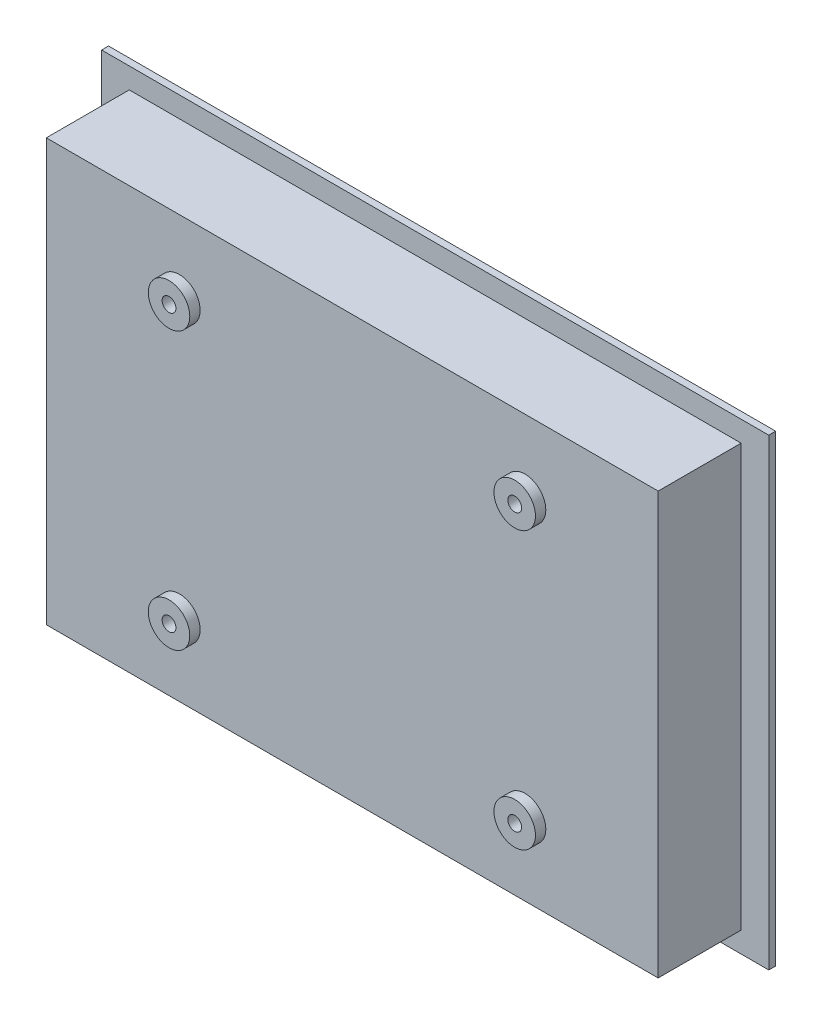
ISO-10303-21;
HEADER;
FILE_DESCRIPTION(('STEP AP214'),'2;1');
FILE_NAME('part.step','',(''),(''),'','','');
FILE_SCHEMA(('AUTOMOTIVE_DESIGN { 1 0 10303 214 1 1 1 1 }'));
ENDSEC;
DATA;
#1=APPLICATION_CONTEXT('core data for automotive mechanical design processes');
#2=APPLICATION_PROTOCOL_DEFINITION('international standard','automotive_design',2000,#1);
#3=PRODUCT_CONTEXT('',#1,'mechanical');
#4=PRODUCT('Part','Part','',(#3));
#5=PRODUCT_RELATED_PRODUCT_CATEGORY('part','',(#4));
#6=PRODUCT_DEFINITION_FORMATION('','',#4);
#7=PRODUCT_DEFINITION_CONTEXT('part definition',#1,'design');
#8=PRODUCT_DEFINITION('design','',#6,#7);
#9=PRODUCT_DEFINITION_SHAPE('','',#8);
#10=(LENGTH_UNIT() NAMED_UNIT(*) SI_UNIT(.MILLI.,.METRE.));
#11=(NAMED_UNIT(*) PLANE_ANGLE_UNIT() SI_UNIT($,.RADIAN.));
#12=(NAMED_UNIT(*) SI_UNIT($,.STERADIAN.) SOLID_ANGLE_UNIT());
#13=UNCERTAINTY_MEASURE_WITH_UNIT(LENGTH_MEASURE(1.E-05),#10,'distance_accuracy_value','');
#14=(GEOMETRIC_REPRESENTATION_CONTEXT(3) GLOBAL_UNCERTAINTY_ASSIGNED_CONTEXT((#13)) GLOBAL_UNIT_ASSIGNED_CONTEXT((#10,
#11,#12)) REPRESENTATION_CONTEXT('',''));
#15=CARTESIAN_POINT('',(0.,0.,0.));
#16=DIRECTION('',(0.,0.,1.));
#17=DIRECTION('',(1.,0.,0.));
#18=AXIS2_PLACEMENT_3D('',#15,#16,#17);
#19=CARTESIAN_POINT('',(0.,0.,26.));
#20=DIRECTION('',(0.,0.,1.));
#21=DIRECTION('',(1.,0.,0.));
#22=AXIS2_PLACEMENT_3D('',#19,#20,#21);
#23=PLANE('',#22);
#24=CARTESIAN_POINT('',(50.,-40.,26.));
#25=DIRECTION('',(0.,0.,1.));
#26=DIRECTION('',(1.,0.,0.));
#27=AXIS2_PLACEMENT_3D('',#24,#25,#26);
#28=CIRCLE('',#27,5.99999999999999);
#29=CARTESIAN_POINT('',(56.,-40.,26.));
#30=VERTEX_POINT('',#29);
#31=EDGE_CURVE('E454',#30,#30,#28,.T.);
#32=ORIENTED_EDGE('',*,*,#31,.F.);
#33=EDGE_LOOP('',(#32));
#34=FACE_BOUND('',#33,.T.);
#35=CARTESIAN_POINT('',(-50.,40.,26.));
#36=DIRECTION('',(0.,0.,1.));
#37=DIRECTION('',(1.,0.,0.));
#38=AXIS2_PLACEMENT_3D('',#35,#36,#37);
#39=CIRCLE('',#38,6.);
#40=CARTESIAN_POINT('',(-44.,40.,26.));
#41=VERTEX_POINT('',#40);
#42=EDGE_CURVE('E472',#41,#41,#39,.T.);
#43=ORIENTED_EDGE('',*,*,#42,.F.);
#44=EDGE_LOOP('',(#43));
#45=FACE_BOUND('',#44,.T.);
#46=DIRECTION('',(0.,1.,0.));
#47=VECTOR('',#46,1.);
#48=CARTESIAN_POINT('',(88.5,61.,26.));
#49=LINE('',#48,#47);
#50=CARTESIAN_POINT('',(88.5,-61.,26.));
#51=VERTEX_POINT('',#50);
#52=CARTESIAN_POINT('',(88.5,61.,26.));
#53=VERTEX_POINT('',#52);
#54=EDGE_CURVE('E121',#51,#53,#49,.T.);
#55=ORIENTED_EDGE('',*,*,#54,.T.);
#56=DIRECTION('',(-1.,0.,0.));
#57=VECTOR('',#56,1.);
#58=CARTESIAN_POINT('',(-88.5,61.,26.));
#59=LINE('',#58,#57);
#60=CARTESIAN_POINT('',(-88.5,61.,26.));
#61=VERTEX_POINT('',#60);
#62=EDGE_CURVE('E110',#53,#61,#59,.T.);
#63=ORIENTED_EDGE('',*,*,#62,.T.);
#64=DIRECTION('',(0.,-1.,0.));
#65=VECTOR('',#64,1.);
#66=CARTESIAN_POINT('',(-88.5,61.,26.));
#67=LINE('',#66,#65);
#68=CARTESIAN_POINT('',(-88.5,-61.,26.));
#69=VERTEX_POINT('',#68);
#70=EDGE_CURVE('E120',#61,#69,#67,.T.);
#71=ORIENTED_EDGE('',*,*,#70,.T.);
#72=DIRECTION('',(1.,0.,0.));
#73=VECTOR('',#72,1.);
#74=CARTESIAN_POINT('',(-88.5,-61.,26.));
#75=LINE('',#74,#73);
#76=EDGE_CURVE('E125',#69,#51,#75,.T.);
#77=ORIENTED_EDGE('',*,*,#76,.T.);
#78=EDGE_LOOP('',(#55,#63,#71,#77));
#79=FACE_BOUND('',#78,.T.);
#80=CARTESIAN_POINT('',(-50.,-40.,26.));
#81=DIRECTION('',(0.,0.,1.));
#82=DIRECTION('',(1.,0.,0.));
#83=AXIS2_PLACEMENT_3D('',#80,#81,#82);
#84=CIRCLE('',#83,6.);
#85=CARTESIAN_POINT('',(-44.,-40.,26.));
#86=VERTEX_POINT('',#85);
#87=EDGE_CURVE('E463',#86,#86,#84,.T.);
#88=ORIENTED_EDGE('',*,*,#87,.F.);
#89=EDGE_LOOP('',(#88));
#90=FACE_BOUND('',#89,.T.);
#91=CARTESIAN_POINT('',(50.,40.,26.));
#92=DIRECTION('',(0.,0.,1.));
#93=DIRECTION('',(1.,0.,0.));
#94=AXIS2_PLACEMENT_3D('',#91,#92,#93);
#95=CIRCLE('',#94,6.);
#96=CARTESIAN_POINT('',(56.,40.,26.));
#97=VERTEX_POINT('',#96);
#98=EDGE_CURVE('E443',#97,#97,#95,.T.);
#99=ORIENTED_EDGE('',*,*,#98,.F.);
#100=EDGE_LOOP('',(#99));
#101=FACE_BOUND('',#100,.T.);
#102=ADVANCED_FACE('F36',(#34,#45,#79,#90,#101),#23,.T.);
#103=CARTESIAN_POINT('',(0.,0.,2.));
#104=DIRECTION('',(0.,0.,1.));
#105=DIRECTION('',(1.,0.,0.));
#106=AXIS2_PLACEMENT_3D('',#103,#104,#105);
#107=PLANE('',#106);
#108=DIRECTION('',(0.,1.,0.));
#109=VECTOR('',#108,1.);
#110=CARTESIAN_POINT('',(96.5,67.,2.));
#111=LINE('',#110,#109);
#112=CARTESIAN_POINT('',(96.5000000000001,-67.,2.));
#113=VERTEX_POINT('',#112);
#114=CARTESIAN_POINT('',(96.5,67.,2.));
#115=VERTEX_POINT('',#114);
#116=EDGE_CURVE('E143',#113,#115,#111,.T.);
#117=ORIENTED_EDGE('',*,*,#116,.T.);
#118=DIRECTION('',(-1.,0.,0.));
#119=VECTOR('',#118,1.);
#120=CARTESIAN_POINT('',(-96.5,67.,2.));
#121=LINE('',#120,#119);
#122=CARTESIAN_POINT('',(-96.5,67.,2.));
#123=VERTEX_POINT('',#122);
#124=EDGE_CURVE('E88',#115,#123,#121,.T.);
#125=ORIENTED_EDGE('',*,*,#124,.T.);
#126=DIRECTION('',(0.,-1.,0.));
#127=VECTOR('',#126,1.);
#128=CARTESIAN_POINT('',(-96.5,67.,2.));
#129=LINE('',#128,#127);
#130=CARTESIAN_POINT('',(-96.5,-67.,2.));
#131=VERTEX_POINT('',#130);
#132=EDGE_CURVE('E146',#123,#131,#129,.T.);
#133=ORIENTED_EDGE('',*,*,#132,.T.);
#134=DIRECTION('',(1.,0.,0.));
#135=VECTOR('',#134,1.);
#136=CARTESIAN_POINT('',(-96.5,-67.,2.));
#137=LINE('',#136,#135);
#138=EDGE_CURVE('E60',#131,#113,#137,.T.);
#139=ORIENTED_EDGE('',*,*,#138,.T.);
#140=EDGE_LOOP('',(#117,#125,#133,#139));
#141=FACE_BOUND('',#140,.T.);
#142=DIRECTION('',(-1.,0.,0.));
#143=VECTOR('',#142,1.);
#144=CARTESIAN_POINT('',(-88.5,61.,2.));
#145=LINE('',#144,#143);
#146=CARTESIAN_POINT('',(88.5,61.,2.));
#147=VERTEX_POINT('',#146);
#148=CARTESIAN_POINT('',(-88.5,61.,2.));
#149=VERTEX_POINT('',#148);
#150=EDGE_CURVE('E492',#147,#149,#145,.T.);
#151=ORIENTED_EDGE('',*,*,#150,.F.);
#152=DIRECTION('',(0.,1.,0.));
#153=VECTOR('',#152,1.);
#154=CARTESIAN_POINT('',(88.5,61.,2.));
#155=LINE('',#154,#153);
#156=CARTESIAN_POINT('',(88.5,-61.,2.));
#157=VERTEX_POINT('',#156);
#158=EDGE_CURVE('E133',#157,#147,#155,.T.);
#159=ORIENTED_EDGE('',*,*,#158,.F.);
#160=DIRECTION('',(1.,0.,0.));
#161=VECTOR('',#160,1.);
#162=CARTESIAN_POINT('',(-88.5,-61.,2.));
#163=LINE('',#162,#161);
#164=CARTESIAN_POINT('',(-88.5,-61.,2.));
#165=VERTEX_POINT('',#164);
#166=EDGE_CURVE('E129',#165,#157,#163,.T.);
#167=ORIENTED_EDGE('',*,*,#166,.F.);
#168=DIRECTION('',(0.,-1.,0.));
#169=VECTOR('',#168,1.);
#170=CARTESIAN_POINT('',(-88.5,61.,2.));
#171=LINE('',#170,#169);
#172=EDGE_CURVE('E494',#149,#165,#171,.T.);
#173=ORIENTED_EDGE('',*,*,#172,.F.);
#174=EDGE_LOOP('',(#151,#159,#167,#173));
#175=FACE_BOUND('',#174,.T.);
#176=ADVANCED_FACE('F179',(#141,#175),#107,.T.);
#177=CARTESIAN_POINT('',(96.5,67.,2.));
#178=DIRECTION('',(-1.,0.,0.));
#179=DIRECTION('',(0.,-1.,0.));
#180=AXIS2_PLACEMENT_3D('',#177,#178,#179);
#181=PLANE('',#180);
#182=DIRECTION('',(0.,1.,0.));
#183=VECTOR('',#182,1.);
#184=CARTESIAN_POINT('',(96.5,67.,0.));
#185=LINE('',#184,#183);
#186=CARTESIAN_POINT('',(96.5000000000001,-67.,0.));
#187=VERTEX_POINT('',#186);
#188=CARTESIAN_POINT('',(96.5,67.,0.));
#189=VERTEX_POINT('',#188);
#190=EDGE_CURVE('E135',#187,#189,#185,.T.);
#191=ORIENTED_EDGE('',*,*,#190,.T.);
#192=DIRECTION('',(0.,0.,-1.));
#193=VECTOR('',#192,1.);
#194=CARTESIAN_POINT('',(96.5,67.,2.));
#195=LINE('',#194,#193);
#196=EDGE_CURVE('E11',#115,#189,#195,.T.);
#197=ORIENTED_EDGE('',*,*,#196,.F.);
#198=ORIENTED_EDGE('',*,*,#116,.F.);
#199=DIRECTION('',(0.,0.,-1.));
#200=VECTOR('',#199,1.);
#201=CARTESIAN_POINT('',(96.5000000000001,-67.,2.));
#202=LINE('',#201,#200);
#203=EDGE_CURVE('E148',#113,#187,#202,.T.);
#204=ORIENTED_EDGE('',*,*,#203,.T.);
#205=EDGE_LOOP('',(#191,#197,#198,#204));
#206=FACE_BOUND('',#205,.T.);
#207=ADVANCED_FACE('F38',(#206),#181,.F.);
#208=CARTESIAN_POINT('',(-96.5,67.,2.));
#209=DIRECTION('',(0.,-1.,0.));
#210=DIRECTION('',(0.,0.,-1.));
#211=AXIS2_PLACEMENT_3D('',#208,#209,#210);
#212=PLANE('',#211);
#213=DIRECTION('',(-1.,0.,0.));
#214=VECTOR('',#213,1.);
#215=CARTESIAN_POINT('',(-96.5,67.,0.));
#216=LINE('',#215,#214);
#217=CARTESIAN_POINT('',(-96.5,67.,0.));
#218=VERTEX_POINT('',#217);
#219=EDGE_CURVE('E138',#189,#218,#216,.T.);
#220=ORIENTED_EDGE('',*,*,#219,.T.);
#221=DIRECTION('',(0.,0.,-1.));
#222=VECTOR('',#221,1.);
#223=CARTESIAN_POINT('',(-96.5,67.,2.));
#224=LINE('',#223,#222);
#225=EDGE_CURVE('E44',#123,#218,#224,.T.);
#226=ORIENTED_EDGE('',*,*,#225,.F.);
#227=ORIENTED_EDGE('',*,*,#124,.F.);
#228=ORIENTED_EDGE('',*,*,#196,.T.);
#229=EDGE_LOOP('',(#220,#226,#227,#228));
#230=FACE_BOUND('',#229,.T.);
#231=ADVANCED_FACE('F176',(#230),#212,.F.);
#232=CARTESIAN_POINT('',(-96.5,67.,2.));
#233=DIRECTION('',(1.,0.,0.));
#234=DIRECTION('',(0.,0.,-1.));
#235=AXIS2_PLACEMENT_3D('',#232,#233,#234);
#236=PLANE('',#235);
#237=DIRECTION('',(0.,-1.,0.));
#238=VECTOR('',#237,1.);
#239=CARTESIAN_POINT('',(-96.5,67.,0.));
#240=LINE('',#239,#238);
#241=CARTESIAN_POINT('',(-96.5,-67.,0.));
#242=VERTEX_POINT('',#241);
#243=EDGE_CURVE('E151',#218,#242,#240,.T.);
#244=ORIENTED_EDGE('',*,*,#243,.T.);
#245=DIRECTION('',(0.,0.,-1.));
#246=VECTOR('',#245,1.);
#247=CARTESIAN_POINT('',(-96.5,-67.,2.));
#248=LINE('',#247,#246);
#249=EDGE_CURVE('E155',#131,#242,#248,.T.);
#250=ORIENTED_EDGE('',*,*,#249,.F.);
#251=ORIENTED_EDGE('',*,*,#132,.F.);
#252=ORIENTED_EDGE('',*,*,#225,.T.);
#253=EDGE_LOOP('',(#244,#250,#251,#252));
#254=FACE_BOUND('',#253,.T.);
#255=ADVANCED_FACE('F160',(#254),#236,.F.);
#256=CARTESIAN_POINT('',(-96.5,-67.,2.));
#257=DIRECTION('',(0.,1.,0.));
#258=DIRECTION('',(0.,0.,1.));
#259=AXIS2_PLACEMENT_3D('',#256,#257,#258);
#260=PLANE('',#259);
#261=DIRECTION('',(1.,0.,0.));
#262=VECTOR('',#261,1.);
#263=CARTESIAN_POINT('',(-96.5,-67.,0.));
#264=LINE('',#263,#262);
#265=EDGE_CURVE('E81',#242,#187,#264,.T.);
#266=ORIENTED_EDGE('',*,*,#265,.T.);
#267=ORIENTED_EDGE('',*,*,#203,.F.);
#268=ORIENTED_EDGE('',*,*,#138,.F.);
#269=ORIENTED_EDGE('',*,*,#249,.T.);
#270=EDGE_LOOP('',(#266,#267,#268,#269));
#271=FACE_BOUND('',#270,.T.);
#272=ADVANCED_FACE('F168',(#271),#260,.F.);
#273=CARTESIAN_POINT('',(0.,0.,0.));
#274=DIRECTION('',(0.,0.,1.));
#275=DIRECTION('',(1.,0.,0.));
#276=AXIS2_PLACEMENT_3D('',#273,#274,#275);
#277=PLANE('',#276);
#278=ORIENTED_EDGE('',*,*,#190,.F.);
#279=ORIENTED_EDGE('',*,*,#265,.F.);
#280=ORIENTED_EDGE('',*,*,#243,.F.);
#281=ORIENTED_EDGE('',*,*,#219,.F.);
#282=EDGE_LOOP('',(#278,#279,#280,#281));
#283=FACE_BOUND('',#282,.T.);
#284=ADVANCED_FACE('F164',(#283),#277,.F.);
#285=CARTESIAN_POINT('',(88.5,61.,26.));
#286=DIRECTION('',(-1.,0.,0.));
#287=DIRECTION('',(0.,0.,1.));
#288=AXIS2_PLACEMENT_3D('',#285,#286,#287);
#289=PLANE('',#288);
#290=ORIENTED_EDGE('',*,*,#158,.T.);
#291=DIRECTION('',(0.,0.,-1.));
#292=VECTOR('',#291,1.);
#293=CARTESIAN_POINT('',(88.5,61.,26.));
#294=LINE('',#293,#292);
#295=EDGE_CURVE('E114',#53,#147,#294,.T.);
#296=ORIENTED_EDGE('',*,*,#295,.F.);
#297=ORIENTED_EDGE('',*,*,#54,.F.);
#298=DIRECTION('',(0.,0.,-1.));
#299=VECTOR('',#298,1.);
#300=CARTESIAN_POINT('',(88.5,-61.,26.));
#301=LINE('',#300,#299);
#302=EDGE_CURVE('E490',#51,#157,#301,.T.);
#303=ORIENTED_EDGE('',*,*,#302,.T.);
#304=EDGE_LOOP('',(#290,#296,#297,#303));
#305=FACE_BOUND('',#304,.T.);
#306=ADVANCED_FACE('F131',(#305),#289,.F.);
#307=CARTESIAN_POINT('',(-88.5,61.,26.));
#308=DIRECTION('',(0.,-1.,0.));
#309=DIRECTION('',(1.,0.,0.));
#310=AXIS2_PLACEMENT_3D('',#307,#308,#309);
#311=PLANE('',#310);
#312=ORIENTED_EDGE('',*,*,#150,.T.);
#313=DIRECTION('',(0.,0.,-1.));
#314=VECTOR('',#313,1.);
#315=CARTESIAN_POINT('',(-88.5,61.,26.));
#316=LINE('',#315,#314);
#317=EDGE_CURVE('E117',#61,#149,#316,.T.);
#318=ORIENTED_EDGE('',*,*,#317,.F.);
#319=ORIENTED_EDGE('',*,*,#62,.F.);
#320=ORIENTED_EDGE('',*,*,#295,.T.);
#321=EDGE_LOOP('',(#312,#318,#319,#320));
#322=FACE_BOUND('',#321,.T.);
#323=ADVANCED_FACE('F112',(#322),#311,.F.);
#324=CARTESIAN_POINT('',(-88.5,61.,26.));
#325=DIRECTION('',(1.,0.,0.));
#326=DIRECTION('',(0.,0.,-1.));
#327=AXIS2_PLACEMENT_3D('',#324,#325,#326);
#328=PLANE('',#327);
#329=ORIENTED_EDGE('',*,*,#172,.T.);
#330=DIRECTION('',(0.,0.,-1.));
#331=VECTOR('',#330,1.);
#332=CARTESIAN_POINT('',(-88.5,-61.,26.));
#333=LINE('',#332,#331);
#334=EDGE_CURVE('E51',#69,#165,#333,.T.);
#335=ORIENTED_EDGE('',*,*,#334,.F.);
#336=ORIENTED_EDGE('',*,*,#70,.F.);
#337=ORIENTED_EDGE('',*,*,#317,.T.);
#338=EDGE_LOOP('',(#329,#335,#336,#337));
#339=FACE_BOUND('',#338,.T.);
#340=ADVANCED_FACE('F196',(#339),#328,.F.);
#341=CARTESIAN_POINT('',(-88.5,-61.,26.));
#342=DIRECTION('',(0.,1.,0.));
#343=DIRECTION('',(0.,0.,1.));
#344=AXIS2_PLACEMENT_3D('',#341,#342,#343);
#345=PLANE('',#344);
#346=ORIENTED_EDGE('',*,*,#166,.T.);
#347=ORIENTED_EDGE('',*,*,#302,.F.);
#348=ORIENTED_EDGE('',*,*,#76,.F.);
#349=ORIENTED_EDGE('',*,*,#334,.T.);
#350=EDGE_LOOP('',(#346,#347,#348,#349));
#351=FACE_BOUND('',#350,.T.);
#352=ADVANCED_FACE('F192',(#351),#345,.F.);
#353=CARTESIAN_POINT('',(-50.,40.,29.));
#354=DIRECTION('',(0.,0.,1.));
#355=DIRECTION('',(1.,0.,0.));
#356=AXIS2_PLACEMENT_3D('',#353,#354,#355);
#357=PLANE('',#356);
#358=CARTESIAN_POINT('',(-50.,40.,29.));
#359=DIRECTION('',(0.,0.,1.));
#360=DIRECTION('',(1.,0.,0.));
#361=AXIS2_PLACEMENT_3D('',#358,#359,#360);
#362=CIRCLE('',#361,6.);
#363=CARTESIAN_POINT('',(-44.,40.,29.));
#364=VERTEX_POINT('',#363);
#365=EDGE_CURVE('E473',#364,#364,#362,.T.);
#366=ORIENTED_EDGE('',*,*,#365,.T.);
#367=EDGE_LOOP('',(#366));
#368=FACE_BOUND('',#367,.T.);
#369=CARTESIAN_POINT('',(-50.,40.,29.));
#370=DIRECTION('',(0.,0.,1.));
#371=DIRECTION('',(1.,0.,0.));
#372=AXIS2_PLACEMENT_3D('',#369,#370,#371);
#373=CIRCLE('',#372,2.);
#374=CARTESIAN_POINT('',(-48.,40.,29.));
#375=VERTEX_POINT('',#374);
#376=EDGE_CURVE('E467',#375,#375,#373,.T.);
#377=ORIENTED_EDGE('',*,*,#376,.F.);
#378=EDGE_LOOP('',(#377));
#379=FACE_BOUND('',#378,.T.);
#380=ADVANCED_FACE('F195',(#368,#379),#357,.T.);
#381=CARTESIAN_POINT('',(-50.,40.,29.));
#382=DIRECTION('',(0.,0.,-1.));
#383=DIRECTION('',(-1.,0.,0.));
#384=AXIS2_PLACEMENT_3D('',#381,#382,#383);
#385=CYLINDRICAL_SURFACE('',#384,6.);
#386=ORIENTED_EDGE('',*,*,#365,.F.);
#387=EDGE_LOOP('',(#386));
#388=FACE_BOUND('',#387,.T.);
#389=ORIENTED_EDGE('',*,*,#42,.T.);
#390=EDGE_LOOP('',(#389));
#391=FACE_BOUND('',#390,.T.);
#392=ADVANCED_FACE('F227',(#388,#391),#385,.T.);
#393=CARTESIAN_POINT('',(-50.,40.,21.));
#394=DIRECTION('',(0.,0.,1.));
#395=DIRECTION('',(1.,0.,0.));
#396=AXIS2_PLACEMENT_3D('',#393,#394,#395);
#397=PLANE('',#396);
#398=CARTESIAN_POINT('',(-50.,40.,21.));
#399=DIRECTION('',(0.,0.,1.));
#400=DIRECTION('',(1.,0.,0.));
#401=AXIS2_PLACEMENT_3D('',#398,#399,#400);
#402=CIRCLE('',#401,2.);
#403=CARTESIAN_POINT('',(-48.,40.,21.));
#404=VERTEX_POINT('',#403);
#405=EDGE_CURVE('E481',#404,#404,#402,.T.);
#406=ORIENTED_EDGE('',*,*,#405,.T.);
#407=EDGE_LOOP('',(#406));
#408=FACE_BOUND('',#407,.T.);
#409=ADVANCED_FACE('F235',(#408),#397,.T.);
#410=CARTESIAN_POINT('',(-50.,40.,36.));
#411=DIRECTION('',(0.,0.,-1.));
#412=DIRECTION('',(-1.,0.,0.));
#413=AXIS2_PLACEMENT_3D('',#410,#411,#412);
#414=CYLINDRICAL_SURFACE('',#413,2.);
#415=ORIENTED_EDGE('',*,*,#405,.F.);
#416=EDGE_LOOP('',(#415));
#417=FACE_BOUND('',#416,.T.);
#418=ORIENTED_EDGE('',*,*,#376,.T.);
#419=EDGE_LOOP('',(#418));
#420=FACE_BOUND('',#419,.T.);
#421=ADVANCED_FACE('F190',(#417,#420),#414,.F.);
#422=CARTESIAN_POINT('',(-50.,-40.,29.));
#423=DIRECTION('',(0.,0.,1.));
#424=DIRECTION('',(1.,0.,0.));
#425=AXIS2_PLACEMENT_3D('',#422,#423,#424);
#426=PLANE('',#425);
#427=CARTESIAN_POINT('',(-50.,-40.,29.));
#428=DIRECTION('',(0.,0.,1.));
#429=DIRECTION('',(1.,0.,0.));
#430=AXIS2_PLACEMENT_3D('',#427,#428,#429);
#431=CIRCLE('',#430,6.);
#432=CARTESIAN_POINT('',(-44.,-40.,29.));
#433=VERTEX_POINT('',#432);
#434=EDGE_CURVE('E464',#433,#433,#431,.T.);
#435=ORIENTED_EDGE('',*,*,#434,.T.);
#436=EDGE_LOOP('',(#435));
#437=FACE_BOUND('',#436,.T.);
#438=CARTESIAN_POINT('',(-50.,-40.,29.));
#439=DIRECTION('',(0.,0.,1.));
#440=DIRECTION('',(1.,0.,0.));
#441=AXIS2_PLACEMENT_3D('',#438,#439,#440);
#442=CIRCLE('',#441,2.);
#443=CARTESIAN_POINT('',(-48.,-40.,29.));
#444=VERTEX_POINT('',#443);
#445=EDGE_CURVE('E458',#444,#444,#442,.T.);
#446=ORIENTED_EDGE('',*,*,#445,.F.);
#447=EDGE_LOOP('',(#446));
#448=FACE_BOUND('',#447,.T.);
#449=ADVANCED_FACE('F249',(#437,#448),#426,.T.);
#450=CARTESIAN_POINT('',(-50.,-40.,29.));
#451=DIRECTION('',(0.,0.,-1.));
#452=DIRECTION('',(-1.,0.,0.));
#453=AXIS2_PLACEMENT_3D('',#450,#451,#452);
#454=CYLINDRICAL_SURFACE('',#453,6.);
#455=ORIENTED_EDGE('',*,*,#434,.F.);
#456=EDGE_LOOP('',(#455));
#457=FACE_BOUND('',#456,.T.);
#458=ORIENTED_EDGE('',*,*,#87,.T.);
#459=EDGE_LOOP('',(#458));
#460=FACE_BOUND('',#459,.T.);
#461=ADVANCED_FACE('F256',(#457,#460),#454,.T.);
#462=CARTESIAN_POINT('',(-50.,-40.,21.));
#463=DIRECTION('',(0.,0.,1.));
#464=DIRECTION('',(1.,0.,0.));
#465=AXIS2_PLACEMENT_3D('',#462,#463,#464);
#466=PLANE('',#465);
#467=CARTESIAN_POINT('',(-50.,-40.,21.));
#468=DIRECTION('',(0.,0.,1.));
#469=DIRECTION('',(1.,0.,0.));
#470=AXIS2_PLACEMENT_3D('',#467,#468,#469);
#471=CIRCLE('',#470,2.);
#472=CARTESIAN_POINT('',(-48.,-40.,21.));
#473=VERTEX_POINT('',#472);
#474=EDGE_CURVE('E478',#473,#473,#471,.T.);
#475=ORIENTED_EDGE('',*,*,#474,.T.);
#476=EDGE_LOOP('',(#475));
#477=FACE_BOUND('',#476,.T.);
#478=ADVANCED_FACE('F264',(#477),#466,.T.);
#479=CARTESIAN_POINT('',(-50.,-40.,36.));
#480=DIRECTION('',(0.,0.,-1.));
#481=DIRECTION('',(-1.,0.,0.));
#482=AXIS2_PLACEMENT_3D('',#479,#480,#481);
#483=CYLINDRICAL_SURFACE('',#482,2.);
#484=ORIENTED_EDGE('',*,*,#474,.F.);
#485=EDGE_LOOP('',(#484));
#486=FACE_BOUND('',#485,.T.);
#487=ORIENTED_EDGE('',*,*,#445,.T.);
#488=EDGE_LOOP('',(#487));
#489=FACE_BOUND('',#488,.T.);
#490=ADVANCED_FACE('F273',(#486,#489),#483,.F.);
#491=CARTESIAN_POINT('',(50.,-40.,29.));
#492=DIRECTION('',(0.,0.,1.));
#493=DIRECTION('',(1.,0.,0.));
#494=AXIS2_PLACEMENT_3D('',#491,#492,#493);
#495=PLANE('',#494);
#496=CARTESIAN_POINT('',(50.,-40.,29.));
#497=DIRECTION('',(0.,0.,1.));
#498=DIRECTION('',(1.,0.,0.));
#499=AXIS2_PLACEMENT_3D('',#496,#497,#498);
#500=CIRCLE('',#499,5.99999999999999);
#501=CARTESIAN_POINT('',(56.,-40.,29.));
#502=VERTEX_POINT('',#501);
#503=EDGE_CURVE('E455',#502,#502,#500,.T.);
#504=ORIENTED_EDGE('',*,*,#503,.T.);
#505=EDGE_LOOP('',(#504));
#506=FACE_BOUND('',#505,.T.);
#507=CARTESIAN_POINT('',(50.,-40.,29.));
#508=DIRECTION('',(0.,0.,1.));
#509=DIRECTION('',(1.,0.,0.));
#510=AXIS2_PLACEMENT_3D('',#507,#508,#509);
#511=CIRCLE('',#510,2.);
#512=CARTESIAN_POINT('',(52.,-40.,29.));
#513=VERTEX_POINT('',#512);
#514=EDGE_CURVE('E450',#513,#513,#511,.T.);
#515=ORIENTED_EDGE('',*,*,#514,.F.);
#516=EDGE_LOOP('',(#515));
#517=FACE_BOUND('',#516,.T.);
#518=ADVANCED_FACE('F281',(#506,#517),#495,.T.);
#519=CARTESIAN_POINT('',(50.,-40.,29.));
#520=DIRECTION('',(0.,0.,-1.));
#521=DIRECTION('',(-1.,0.,0.));
#522=AXIS2_PLACEMENT_3D('',#519,#520,#521);
#523=CYLINDRICAL_SURFACE('',#522,5.99999999999999);
#524=ORIENTED_EDGE('',*,*,#503,.F.);
#525=EDGE_LOOP('',(#524));
#526=FACE_BOUND('',#525,.T.);
#527=ORIENTED_EDGE('',*,*,#31,.T.);
#528=EDGE_LOOP('',(#527));
#529=FACE_BOUND('',#528,.T.);
#530=ADVANCED_FACE('F289',(#526,#529),#523,.T.);
#531=CARTESIAN_POINT('',(50.,-40.,21.));
#532=DIRECTION('',(0.,0.,1.));
#533=DIRECTION('',(1.,0.,0.));
#534=AXIS2_PLACEMENT_3D('',#531,#532,#533);
#535=PLANE('',#534);
#536=CARTESIAN_POINT('',(50.,-40.,21.));
#537=DIRECTION('',(0.,0.,1.));
#538=DIRECTION('',(1.,0.,0.));
#539=AXIS2_PLACEMENT_3D('',#536,#537,#538);
#540=CIRCLE('',#539,2.);
#541=CARTESIAN_POINT('',(52.,-40.,21.));
#542=VERTEX_POINT('',#541);
#543=EDGE_CURVE('E482',#542,#542,#540,.T.);
#544=ORIENTED_EDGE('',*,*,#543,.T.);
#545=EDGE_LOOP('',(#544));
#546=FACE_BOUND('',#545,.T.);
#547=ADVANCED_FACE('F297',(#546),#535,.T.);
#548=CARTESIAN_POINT('',(50.,-40.,36.));
#549=DIRECTION('',(0.,0.,-1.));
#550=DIRECTION('',(-1.,0.,0.));
#551=AXIS2_PLACEMENT_3D('',#548,#549,#550);
#552=CYLINDRICAL_SURFACE('',#551,2.);
#553=ORIENTED_EDGE('',*,*,#543,.F.);
#554=EDGE_LOOP('',(#553));
#555=FACE_BOUND('',#554,.T.);
#556=ORIENTED_EDGE('',*,*,#514,.T.);
#557=EDGE_LOOP('',(#556));
#558=FACE_BOUND('',#557,.T.);
#559=ADVANCED_FACE('F305',(#555,#558),#552,.F.);
#560=CARTESIAN_POINT('',(50.,40.,29.));
#561=DIRECTION('',(0.,0.,1.));
#562=DIRECTION('',(1.,0.,0.));
#563=AXIS2_PLACEMENT_3D('',#560,#561,#562);
#564=PLANE('',#563);
#565=CARTESIAN_POINT('',(50.,40.,29.));
#566=DIRECTION('',(0.,0.,1.));
#567=DIRECTION('',(1.,0.,0.));
#568=AXIS2_PLACEMENT_3D('',#565,#566,#567);
#569=CIRCLE('',#568,6.);
#570=CARTESIAN_POINT('',(56.,40.,29.));
#571=VERTEX_POINT('',#570);
#572=EDGE_CURVE('E446',#571,#571,#569,.T.);
#573=ORIENTED_EDGE('',*,*,#572,.T.);
#574=EDGE_LOOP('',(#573));
#575=FACE_BOUND('',#574,.T.);
#576=CARTESIAN_POINT('',(50.,40.,29.));
#577=DIRECTION('',(0.,0.,1.));
#578=DIRECTION('',(1.,0.,0.));
#579=AXIS2_PLACEMENT_3D('',#576,#577,#578);
#580=CIRCLE('',#579,2.);
#581=CARTESIAN_POINT('',(52.,40.,29.));
#582=VERTEX_POINT('',#581);
#583=EDGE_CURVE('E441',#582,#582,#580,.T.);
#584=ORIENTED_EDGE('',*,*,#583,.F.);
#585=EDGE_LOOP('',(#584));
#586=FACE_BOUND('',#585,.T.);
#587=ADVANCED_FACE('F312',(#575,#586),#564,.T.);
#588=CARTESIAN_POINT('',(50.,40.,29.));
#589=DIRECTION('',(0.,0.,-1.));
#590=DIRECTION('',(-1.,0.,0.));
#591=AXIS2_PLACEMENT_3D('',#588,#589,#590);
#592=CYLINDRICAL_SURFACE('',#591,6.);
#593=ORIENTED_EDGE('',*,*,#572,.F.);
#594=EDGE_LOOP('',(#593));
#595=FACE_BOUND('',#594,.T.);
#596=ORIENTED_EDGE('',*,*,#98,.T.);
#597=EDGE_LOOP('',(#596));
#598=FACE_BOUND('',#597,.T.);
#599=ADVANCED_FACE('F320',(#595,#598),#592,.T.);
#600=CARTESIAN_POINT('',(50.,40.,21.));
#601=DIRECTION('',(0.,0.,1.));
#602=DIRECTION('',(1.,0.,0.));
#603=AXIS2_PLACEMENT_3D('',#600,#601,#602);
#604=PLANE('',#603);
#605=CARTESIAN_POINT('',(50.,40.,21.));
#606=DIRECTION('',(0.,0.,1.));
#607=DIRECTION('',(1.,0.,0.));
#608=AXIS2_PLACEMENT_3D('',#605,#606,#607);
#609=CIRCLE('',#608,2.);
#610=CARTESIAN_POINT('',(52.,40.,21.));
#611=VERTEX_POINT('',#610);
#612=EDGE_CURVE('E438',#611,#611,#609,.T.);
#613=ORIENTED_EDGE('',*,*,#612,.T.);
#614=EDGE_LOOP('',(#613));
#615=FACE_BOUND('',#614,.T.);
#616=ADVANCED_FACE('F328',(#615),#604,.T.);
#617=CARTESIAN_POINT('',(50.,40.,36.));
#618=DIRECTION('',(0.,0.,-1.));
#619=DIRECTION('',(-1.,0.,0.));
#620=AXIS2_PLACEMENT_3D('',#617,#618,#619);
#621=CYLINDRICAL_SURFACE('',#620,2.);
#622=ORIENTED_EDGE('',*,*,#612,.F.);
#623=EDGE_LOOP('',(#622));
#624=FACE_BOUND('',#623,.T.);
#625=ORIENTED_EDGE('',*,*,#583,.T.);
#626=EDGE_LOOP('',(#625));
#627=FACE_BOUND('',#626,.T.);
#628=ADVANCED_FACE('F336',(#624,#627),#621,.F.);
#629=CLOSED_SHELL('',(#102,#176,#207,#231,#255,#272,#284,#306,#323,#340,#352,#380,#392,#409,
#421,#449,#461,#478,#490,#518,#530,#547,#559,#587,#599,#616,#628));
#630=MANIFOLD_SOLID_BREP('B2',#629);
#631=ADVANCED_BREP_SHAPE_REPRESENTATION('',(#18,#630),#14);
#632=SHAPE_DEFINITION_REPRESENTATION(#9,#631);
ENDSEC;
END-ISO-10303-21;
